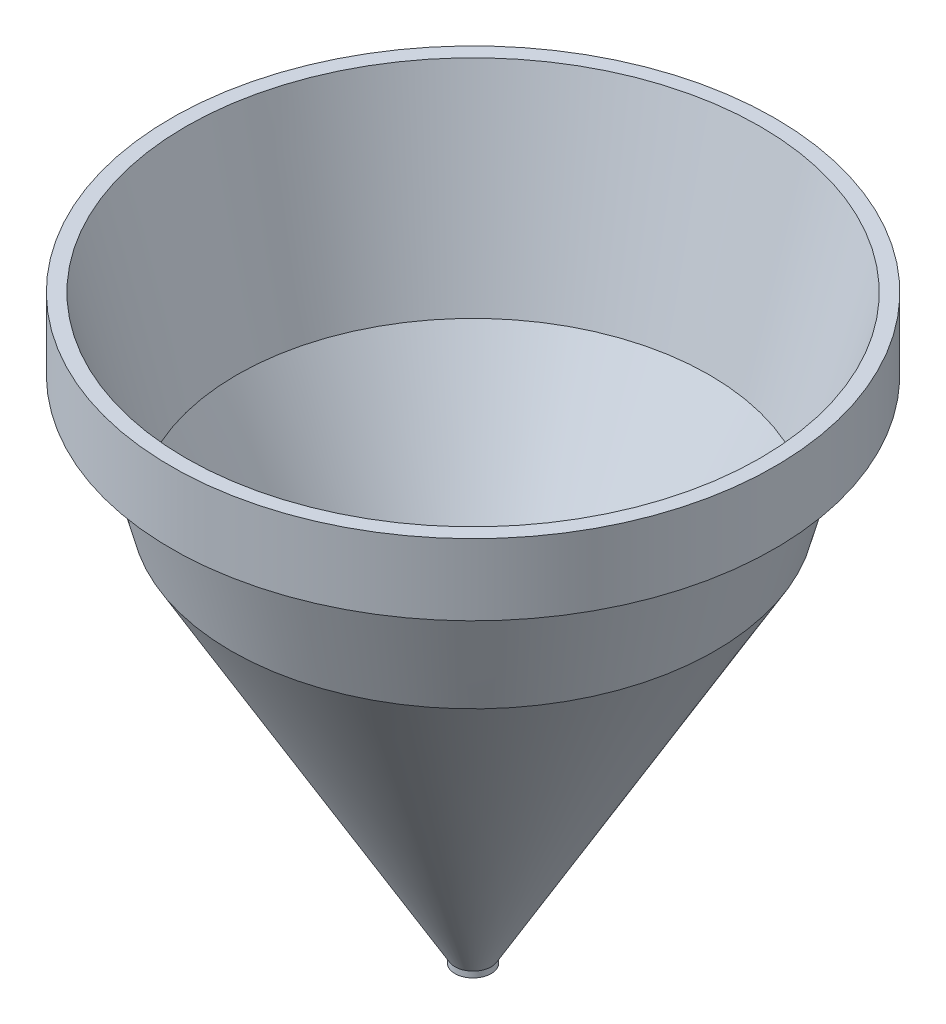
ISO-10303-21;
HEADER;
FILE_DESCRIPTION(('STEP AP214'),'2;1');
FILE_NAME('part.step','',(''),(''),'','','');
FILE_SCHEMA(('AUTOMOTIVE_DESIGN { 1 0 10303 214 1 1 1 1 }'));
ENDSEC;
DATA;
#1=APPLICATION_CONTEXT('core data for automotive mechanical design processes');
#2=APPLICATION_PROTOCOL_DEFINITION('international standard','automotive_design',2000,#1);
#3=PRODUCT_CONTEXT('',#1,'mechanical');
#4=PRODUCT('Part','Part','',(#3));
#5=PRODUCT_RELATED_PRODUCT_CATEGORY('part','',(#4));
#6=PRODUCT_DEFINITION_FORMATION('','',#4);
#7=PRODUCT_DEFINITION_CONTEXT('part definition',#1,'design');
#8=PRODUCT_DEFINITION('design','',#6,#7);
#9=PRODUCT_DEFINITION_SHAPE('','',#8);
#10=(LENGTH_UNIT() NAMED_UNIT(*) SI_UNIT(.MILLI.,.METRE.));
#11=(NAMED_UNIT(*) PLANE_ANGLE_UNIT() SI_UNIT($,.RADIAN.));
#12=(NAMED_UNIT(*) SI_UNIT($,.STERADIAN.) SOLID_ANGLE_UNIT());
#13=UNCERTAINTY_MEASURE_WITH_UNIT(LENGTH_MEASURE(1.E-05),#10,'distance_accuracy_value','');
#14=(GEOMETRIC_REPRESENTATION_CONTEXT(3) GLOBAL_UNCERTAINTY_ASSIGNED_CONTEXT((#13)) GLOBAL_UNIT_ASSIGNED_CONTEXT((#10,
#11,#12)) REPRESENTATION_CONTEXT('',''));
#15=CARTESIAN_POINT('',(0.,0.,0.));
#16=DIRECTION('',(0.,0.,1.));
#17=DIRECTION('',(1.,0.,0.));
#18=AXIS2_PLACEMENT_3D('',#15,#16,#17);
#19=CARTESIAN_POINT('',(0.,130.,0.));
#20=DIRECTION('',(0.,1.,0.));
#21=DIRECTION('',(0.,0.,1.));
#22=AXIS2_PLACEMENT_3D('',#19,#20,#21);
#23=CONICAL_SURFACE('',#22,79.7390432537056,0.261799387799151);
#24=CARTESIAN_POINT('',(0.,194.,0.));
#25=DIRECTION('',(0.,-1.,0.));
#26=DIRECTION('',(0.,0.,-1.));
#27=AXIS2_PLACEMENT_3D('',#24,#25,#26);
#28=CIRCLE('',#27,96.8877915692976);
#29=CARTESIAN_POINT('',(0.,194.,-96.8877915692976));
#30=VERTEX_POINT('',#29);
#31=EDGE_CURVE('E10',#30,#30,#28,.T.);
#32=ORIENTED_EDGE('',*,*,#31,.F.);
#33=EDGE_LOOP('',(#32));
#34=FACE_BOUND('',#33,.T.);
#35=CARTESIAN_POINT('',(0.,130.,0.));
#36=DIRECTION('',(0.,-1.,0.));
#37=DIRECTION('',(0.,0.,-1.));
#38=AXIS2_PLACEMENT_3D('',#35,#36,#37);
#39=CIRCLE('',#38,79.7390432537056);
#40=CARTESIAN_POINT('',(0.,130.,79.7390432537056));
#41=VERTEX_POINT('',#40);
#42=EDGE_CURVE('E72',#41,#41,#39,.T.);
#43=ORIENTED_EDGE('',*,*,#42,.T.);
#44=EDGE_LOOP('',(#43));
#45=FACE_BOUND('',#44,.T.);
#46=ADVANCED_FACE('F32',(#34,#45),#23,.F.);
#47=CARTESIAN_POINT('',(0.,194.,1.09616310980966E-12));
#48=DIRECTION('',(0.,-1.,0.));
#49=DIRECTION('',(0.,0.,-1.));
#50=AXIS2_PLACEMENT_3D('',#47,#48,#49);
#51=PLANE('',#50);
#52=CARTESIAN_POINT('',(0.,194.,0.));
#53=DIRECTION('',(0.,-1.,0.));
#54=DIRECTION('',(0.,0.,-1.));
#55=AXIS2_PLACEMENT_3D('',#52,#53,#54);
#56=CIRCLE('',#55,101.8);
#57=CARTESIAN_POINT('',(0.,194.,-101.8));
#58=VERTEX_POINT('',#57);
#59=EDGE_CURVE('E38',#58,#58,#56,.T.);
#60=ORIENTED_EDGE('',*,*,#59,.F.);
#61=EDGE_LOOP('',(#60));
#62=FACE_BOUND('',#61,.T.);
#63=ORIENTED_EDGE('',*,*,#31,.T.);
#64=EDGE_LOOP('',(#63));
#65=FACE_BOUND('',#64,.T.);
#66=ADVANCED_FACE('F95',(#62,#65),#51,.F.);
#67=CARTESIAN_POINT('',(0.,0.,0.));
#68=DIRECTION('',(0.,-1.,0.));
#69=DIRECTION('',(0.,0.,-1.));
#70=AXIS2_PLACEMENT_3D('',#67,#68,#69);
#71=CYLINDRICAL_SURFACE('',#70,101.8);
#72=ORIENTED_EDGE('',*,*,#59,.T.);
#73=EDGE_LOOP('',(#72));
#74=FACE_BOUND('',#73,.T.);
#75=CARTESIAN_POINT('',(0.,170.,0.));
#76=DIRECTION('',(0.,-1.,0.));
#77=DIRECTION('',(0.,0.,-1.));
#78=AXIS2_PLACEMENT_3D('',#75,#76,#77);
#79=CIRCLE('',#78,101.8);
#80=CARTESIAN_POINT('',(0.,170.,-101.8));
#81=VERTEX_POINT('',#80);
#82=EDGE_CURVE('E42',#81,#81,#79,.T.);
#83=ORIENTED_EDGE('',*,*,#82,.F.);
#84=EDGE_LOOP('',(#83));
#85=FACE_BOUND('',#84,.T.);
#86=ADVANCED_FACE('F100',(#74,#85),#71,.T.);
#87=CARTESIAN_POINT('',(0.,170.,0.));
#88=DIRECTION('',(0.,-1.,0.));
#89=DIRECTION('',(0.,0.,-1.));
#90=AXIS2_PLACEMENT_3D('',#87,#88,#89);
#91=PLANE('',#90);
#92=ORIENTED_EDGE('',*,*,#82,.T.);
#93=EDGE_LOOP('',(#92));
#94=FACE_BOUND('',#93,.T.);
#95=CARTESIAN_POINT('',(0.,170.,0.));
#96=DIRECTION('',(0.,-1.,0.));
#97=DIRECTION('',(0.,0.,-1.));
#98=AXIS2_PLACEMENT_3D('',#95,#96,#97);
#99=CIRCLE('',#98,100.);
#100=CARTESIAN_POINT('',(0.,170.,-100.));
#101=VERTEX_POINT('',#100);
#102=EDGE_CURVE('E46',#101,#101,#99,.T.);
#103=ORIENTED_EDGE('',*,*,#102,.F.);
#104=EDGE_LOOP('',(#103));
#105=FACE_BOUND('',#104,.T.);
#106=ADVANCED_FACE('F105',(#94,#105),#91,.T.);
#107=CARTESIAN_POINT('',(0.,0.,0.));
#108=DIRECTION('',(0.,-1.,0.));
#109=DIRECTION('',(0.,0.,-1.));
#110=AXIS2_PLACEMENT_3D('',#107,#108,#109);
#111=CYLINDRICAL_SURFACE('',#110,100.);
#112=ORIENTED_EDGE('',*,*,#102,.T.);
#113=EDGE_LOOP('',(#112));
#114=FACE_BOUND('',#113,.T.);
#115=CARTESIAN_POINT('',(0.,180.,0.));
#116=DIRECTION('',(0.,-1.,0.));
#117=DIRECTION('',(0.,0.,-1.));
#118=AXIS2_PLACEMENT_3D('',#115,#116,#117);
#119=CIRCLE('',#118,100.);
#120=CARTESIAN_POINT('',(0.,180.,-100.));
#121=VERTEX_POINT('',#120);
#122=EDGE_CURVE('E51',#121,#121,#119,.T.);
#123=ORIENTED_EDGE('',*,*,#122,.F.);
#124=EDGE_LOOP('',(#123));
#125=FACE_BOUND('',#124,.T.);
#126=ADVANCED_FACE('F110',(#114,#125),#111,.F.);
#127=CARTESIAN_POINT('',(0.,180.,0.));
#128=DIRECTION('',(0.,1.,0.));
#129=DIRECTION('',(0.,0.,1.));
#130=AXIS2_PLACEMENT_3D('',#127,#128,#129);
#131=PLANE('',#130);
#132=CARTESIAN_POINT('',(0.,180.,0.));
#133=DIRECTION('',(0.,-1.,0.));
#134=DIRECTION('',(0.,0.,-1.));
#135=AXIS2_PLACEMENT_3D('',#132,#133,#134);
#136=CIRCLE('',#135,95.);
#137=CARTESIAN_POINT('',(0.,180.,-95.));
#138=VERTEX_POINT('',#137);
#139=EDGE_CURVE('E54',#138,#138,#136,.T.);
#140=ORIENTED_EDGE('',*,*,#139,.F.);
#141=EDGE_LOOP('',(#140));
#142=FACE_BOUND('',#141,.T.);
#143=ORIENTED_EDGE('',*,*,#122,.T.);
#144=EDGE_LOOP('',(#143));
#145=FACE_BOUND('',#144,.T.);
#146=ADVANCED_FACE('F114',(#142,#145),#131,.F.);
#147=CARTESIAN_POINT('',(0.,180.,0.));
#148=DIRECTION('',(0.,1.,0.));
#149=DIRECTION('',(0.,0.,1.));
#150=AXIS2_PLACEMENT_3D('',#147,#148,#149);
#151=CONICAL_SURFACE('',#150,95.,0.26179938779915);
#152=CARTESIAN_POINT('',(0.,130.,0.));
#153=DIRECTION('',(0.,-1.,0.));
#154=DIRECTION('',(0.,0.,-1.));
#155=AXIS2_PLACEMENT_3D('',#152,#153,#154);
#156=CIRCLE('',#155,81.6025403784438);
#157=CARTESIAN_POINT('',(0.,130.,81.6025403784438));
#158=VERTEX_POINT('',#157);
#159=EDGE_CURVE('E57',#158,#158,#156,.T.);
#160=ORIENTED_EDGE('',*,*,#159,.F.);
#161=EDGE_LOOP('',(#160));
#162=FACE_BOUND('',#161,.T.);
#163=ORIENTED_EDGE('',*,*,#139,.T.);
#164=EDGE_LOOP('',(#163));
#165=FACE_BOUND('',#164,.T.);
#166=ADVANCED_FACE('F118',(#162,#165),#151,.T.);
#167=CARTESIAN_POINT('',(0.,130.,0.));
#168=DIRECTION('',(0.,1.,0.));
#169=DIRECTION('',(0.,0.,1.));
#170=AXIS2_PLACEMENT_3D('',#167,#168,#169);
#171=CONICAL_SURFACE('',#170,81.6025403784438,0.526096173447133);
#172=CARTESIAN_POINT('',(0.,0.,0.));
#173=DIRECTION('',(0.,-1.,0.));
#174=DIRECTION('',(0.,0.,-1.));
#175=AXIS2_PLACEMENT_3D('',#172,#173,#174);
#176=CIRCLE('',#175,6.11349712473817);
#177=CARTESIAN_POINT('',(0.,0.,6.11349712473815));
#178=VERTEX_POINT('',#177);
#179=EDGE_CURVE('E60',#178,#178,#176,.T.);
#180=CARTESIAN_POINT('',(0.,0.,6.11349712473815));
#181=CARTESIAN_POINT('',(0.,1.35416666666664,6.89984132529758));
#182=CARTESIAN_POINT('',(0.,2.7083333333333,7.68618552585701));
#183=CARTESIAN_POINT('',(0.,5.41666666666663,9.25887392697588));
#184=CARTESIAN_POINT('',(0.,6.7708333333333,10.0452181275353));
#185=CARTESIAN_POINT('',(0.,9.47916666666664,11.6179065286542));
#186=CARTESIAN_POINT('',(0.,10.8333333333333,12.4042507292136));
#187=CARTESIAN_POINT('',(0.,13.5416666666666,13.9769391303325));
#188=CARTESIAN_POINT('',(0.,14.8958333333333,14.7632833308919));
#189=CARTESIAN_POINT('',(0.,17.6041666666666,16.3359717320108));
#190=CARTESIAN_POINT('',(0.,18.9583333333333,17.1223159325702));
#191=CARTESIAN_POINT('',(0.,21.6666666666666,18.6950043336891));
#192=CARTESIAN_POINT('',(0.,23.0208333333333,19.4813485342485));
#193=CARTESIAN_POINT('',(0.,25.7291666666666,21.0540369353674));
#194=CARTESIAN_POINT('',(0.,27.0833333333333,21.8403811359268));
#195=CARTESIAN_POINT('',(0.,29.7916666666666,23.4130695370457));
#196=CARTESIAN_POINT('',(0.,31.1458333333333,24.1994137376051));
#197=CARTESIAN_POINT('',(0.,33.8541666666666,25.772102138724));
#198=CARTESIAN_POINT('',(0.,35.2083333333333,26.5584463392834));
#199=CARTESIAN_POINT('',(0.,37.9166666666666,28.1311347404023));
#200=CARTESIAN_POINT('',(0.,39.2708333333333,28.9174789409617));
#201=CARTESIAN_POINT('',(0.,41.9791666666666,30.4901673420806));
#202=CARTESIAN_POINT('',(0.,43.3333333333333,31.27651154264));
#203=CARTESIAN_POINT('',(0.,46.0416666666666,32.8491999437589));
#204=CARTESIAN_POINT('',(0.,47.3958333333333,33.6355441443183));
#205=CARTESIAN_POINT('',(0.,50.1041666666666,35.2082325454372));
#206=CARTESIAN_POINT('',(0.,51.4583333333333,35.9945767459966));
#207=CARTESIAN_POINT('',(0.,54.1666666666666,37.5672651471155));
#208=CARTESIAN_POINT('',(0.,55.5208333333333,38.3536093476749));
#209=CARTESIAN_POINT('',(0.,58.2291666666666,39.9262977487938));
#210=CARTESIAN_POINT('',(0.,59.5833333333333,40.7126419493532));
#211=CARTESIAN_POINT('',(0.,62.2916666666666,42.2853303504721));
#212=CARTESIAN_POINT('',(0.,63.6458333333333,43.0716745510315));
#213=CARTESIAN_POINT('',(0.,66.3541666666666,44.6443629521504));
#214=CARTESIAN_POINT('',(0.,67.7083333333333,45.4307071527099));
#215=CARTESIAN_POINT('',(0.,70.4166666666666,47.0033955538287));
#216=CARTESIAN_POINT('',(0.,71.7708333333333,47.7897397543882));
#217=CARTESIAN_POINT('',(0.,74.4791666666666,49.362428155507));
#218=CARTESIAN_POINT('',(0.,75.8333333333333,50.1487723560665));
#219=CARTESIAN_POINT('',(0.,78.5416666666666,51.7214607571853));
#220=CARTESIAN_POINT('',(0.,79.8958333333333,52.5078049577448));
#221=CARTESIAN_POINT('',(0.,82.6041666666666,54.0804933588636));
#222=CARTESIAN_POINT('',(0.,83.9583333333333,54.8668375594231));
#223=CARTESIAN_POINT('',(0.,86.6666666666666,56.4395259605419));
#224=CARTESIAN_POINT('',(0.,88.0208333333333,57.2258701611014));
#225=CARTESIAN_POINT('',(0.,90.7291666666667,58.7985585622202));
#226=CARTESIAN_POINT('',(0.,92.0833333333333,59.5849027627797));
#227=CARTESIAN_POINT('',(0.,94.7916666666666,61.1575911638985));
#228=CARTESIAN_POINT('',(0.,96.1458333333333,61.943935364458));
#229=CARTESIAN_POINT('',(0.,98.8541666666666,63.5166237655768));
#230=CARTESIAN_POINT('',(0.,100.208333333333,64.3029679661363));
#231=CARTESIAN_POINT('',(0.,102.916666666667,65.8756563672551));
#232=CARTESIAN_POINT('',(0.,104.270833333333,66.6620005678146));
#233=CARTESIAN_POINT('',(0.,106.979166666667,68.2346889689334));
#234=CARTESIAN_POINT('',(0.,108.333333333333,69.0210331694929));
#235=CARTESIAN_POINT('',(0.,111.041666666667,70.5937215706117));
#236=CARTESIAN_POINT('',(0.,112.395833333333,71.3800657711712));
#237=CARTESIAN_POINT('',(0.,115.104166666667,72.9527541722901));
#238=CARTESIAN_POINT('',(0.,116.458333333333,73.7390983728495));
#239=CARTESIAN_POINT('',(0.,119.166666666667,75.3117867739684));
#240=CARTESIAN_POINT('',(0.,120.520833333333,76.0981309745278));
#241=CARTESIAN_POINT('',(0.,123.229166666667,77.6708193756467));
#242=CARTESIAN_POINT('',(0.,124.583333333333,78.4571635762061));
#243=CARTESIAN_POINT('',(0.,127.291666666667,80.029851977325));
#244=CARTESIAN_POINT('',(0.,128.645833333333,80.8161961778844));
#245=CARTESIAN_POINT('',(0.,130.,81.6025403784438));
#246=B_SPLINE_CURVE_WITH_KNOTS('',3,(#180,#181,#182,#183,#184,#185,#186,#187,#188,#189,#190,
#191,#192,#193,#194,#195,#196,#197,#198,#199,#200,#201,#202,#203,#204,#205,#206,#207,#208,#209,
#210,#211,#212,#213,#214,#215,#216,#217,#218,#219,#220,#221,#222,#223,#224,#225,#226,#227,#228,
#229,#230,#231,#232,#233,#234,#235,#236,#237,#238,#239,#240,#241,#242,#243,#244,#245),
.UNSPECIFIED.,.F.,.F.,(4,2,2,2,2,2,2,2,2,2,2,2,2,2,2,2,2,2,2,2,2,2,2,2,2,2,2,2,2,2,2,2,4),(0.,
4.69775915365838,9.39551830731675,14.0932774609751,18.7910366146335,23.4887957682919,
28.1865549219503,32.8843140756087,37.582073229267,42.2798323829254,46.9775915365838,
51.6753506902422,56.3731098439006,61.0708689975589,65.7686281512173,70.4663873048757,
75.1641464585341,79.8619056121924,84.5596647658508,89.2574239195092,93.9551830731676,
98.652942226826,103.350701380484,108.048460534143,112.746219687801,117.443978841459,
122.141737995118,126.839497148776,131.537256302435,136.235015456093,140.932774609751,
145.63053376341,150.328292917068),.UNSPECIFIED.);
#247=EDGE_CURVE('BSEAM122',#178,#158,#246,.T.);
#248=ORIENTED_EDGE('',*,*,#179,.F.);
#249=ORIENTED_EDGE('',*,*,#159,.T.);
#250=ORIENTED_EDGE('',*,*,#247,.T.);
#251=ORIENTED_EDGE('',*,*,#247,.F.);
#252=EDGE_LOOP('',(#248,#250,#249,#251));
#253=FACE_BOUND('',#252,.T.);
#254=ADVANCED_FACE('F122',(#253),#171,.T.);
#255=CARTESIAN_POINT('',(0.,0.,0.));
#256=DIRECTION('',(0.,-1.,0.));
#257=DIRECTION('',(0.,0.,-1.));
#258=AXIS2_PLACEMENT_3D('',#255,#256,#257);
#259=CYLINDRICAL_SURFACE('',#258,6.11349712473818);
#260=CARTESIAN_POINT('',(0.,-2.,0.));
#261=DIRECTION('',(0.,-1.,0.));
#262=DIRECTION('',(0.,0.,-1.));
#263=AXIS2_PLACEMENT_3D('',#260,#261,#262);
#264=CIRCLE('',#263,6.11349712473819);
#265=CARTESIAN_POINT('',(0.,-2.,-6.11349712473819));
#266=VERTEX_POINT('',#265);
#267=EDGE_CURVE('E63',#266,#266,#264,.T.);
#268=ORIENTED_EDGE('',*,*,#267,.F.);
#269=EDGE_LOOP('',(#268));
#270=FACE_BOUND('',#269,.T.);
#271=ORIENTED_EDGE('',*,*,#179,.T.);
#272=EDGE_LOOP('',(#271));
#273=FACE_BOUND('',#272,.T.);
#274=ADVANCED_FACE('F91',(#270,#273),#259,.T.);
#275=CARTESIAN_POINT('',(0.,-2.,0.));
#276=DIRECTION('',(0.,1.,0.));
#277=DIRECTION('',(0.,0.,1.));
#278=AXIS2_PLACEMENT_3D('',#275,#276,#277);
#279=PLANE('',#278);
#280=CARTESIAN_POINT('',(0.,-2.,0.));
#281=DIRECTION('',(0.,-1.,0.));
#282=DIRECTION('',(0.,0.,-1.));
#283=AXIS2_PLACEMENT_3D('',#280,#281,#282);
#284=CIRCLE('',#283,4.25);
#285=CARTESIAN_POINT('',(0.,-2.,-4.25));
#286=VERTEX_POINT('',#285);
#287=EDGE_CURVE('E66',#286,#286,#284,.T.);
#288=ORIENTED_EDGE('',*,*,#287,.F.);
#289=EDGE_LOOP('',(#288));
#290=FACE_BOUND('',#289,.T.);
#291=ORIENTED_EDGE('',*,*,#267,.T.);
#292=EDGE_LOOP('',(#291));
#293=FACE_BOUND('',#292,.T.);
#294=ADVANCED_FACE('F85',(#290,#293),#279,.F.);
#295=CARTESIAN_POINT('',(0.,0.,0.));
#296=DIRECTION('',(0.,-1.,0.));
#297=DIRECTION('',(0.,0.,-1.));
#298=AXIS2_PLACEMENT_3D('',#295,#296,#297);
#299=CYLINDRICAL_SURFACE('',#298,4.25);
#300=ORIENTED_EDGE('',*,*,#287,.T.);
#301=EDGE_LOOP('',(#300));
#302=FACE_BOUND('',#301,.T.);
#303=CARTESIAN_POINT('',(0.,0.,0.));
#304=DIRECTION('',(0.,-1.,0.));
#305=DIRECTION('',(0.,0.,-1.));
#306=AXIS2_PLACEMENT_3D('',#303,#304,#305);
#307=CIRCLE('',#306,4.25);
#308=CARTESIAN_POINT('',(0.,0.,4.25));
#309=VERTEX_POINT('',#308);
#310=EDGE_CURVE('E69',#309,#309,#307,.T.);
#311=ORIENTED_EDGE('',*,*,#310,.F.);
#312=EDGE_LOOP('',(#311));
#313=FACE_BOUND('',#312,.T.);
#314=ADVANCED_FACE('F80',(#302,#313),#299,.F.);
#315=CARTESIAN_POINT('',(0.,0.,0.));
#316=DIRECTION('',(0.,1.,0.));
#317=DIRECTION('',(0.,0.,1.));
#318=AXIS2_PLACEMENT_3D('',#315,#316,#317);
#319=CONICAL_SURFACE('',#318,4.25,0.526096173447133);
#320=CARTESIAN_POINT('',(0.,130.,79.7390432537056));
#321=CARTESIAN_POINT('',(0.,128.645833333333,78.9526990531462));
#322=CARTESIAN_POINT('',(0.,127.291666666667,78.1663548525868));
#323=CARTESIAN_POINT('',(0.,124.583333333333,76.5936664514679));
#324=CARTESIAN_POINT('',(0.,123.229166666667,75.8073222509085));
#325=CARTESIAN_POINT('',(0.,120.520833333333,74.2346338497896));
#326=CARTESIAN_POINT('',(0.,119.166666666667,73.4482896492302));
#327=CARTESIAN_POINT('',(0.,116.458333333333,71.8756012481113));
#328=CARTESIAN_POINT('',(0.,115.104166666667,71.0892570475519));
#329=CARTESIAN_POINT('',(0.,112.395833333333,69.516568646433));
#330=CARTESIAN_POINT('',(0.,111.041666666667,68.7302244458735));
#331=CARTESIAN_POINT('',(0.,108.333333333333,67.1575360447547));
#332=CARTESIAN_POINT('',(0.,106.979166666667,66.3711918441953));
#333=CARTESIAN_POINT('',(0.,104.270833333333,64.7985034430764));
#334=CARTESIAN_POINT('',(0.,102.916666666667,64.0121592425169));
#335=CARTESIAN_POINT('',(0.,100.208333333333,62.4394708413981));
#336=CARTESIAN_POINT('',(0.,98.8541666666667,61.6531266408386));
#337=CARTESIAN_POINT('',(0.,96.1458333333333,60.0804382397198));
#338=CARTESIAN_POINT('',(0.,94.7916666666667,59.2940940391603));
#339=CARTESIAN_POINT('',(0.,92.0833333333333,57.7214056380415));
#340=CARTESIAN_POINT('',(0.,90.7291666666667,56.9350614374821));
#341=CARTESIAN_POINT('',(0.,88.0208333333333,55.3623730363632));
#342=CARTESIAN_POINT('',(0.,86.6666666666667,54.5760288358037));
#343=CARTESIAN_POINT('',(0.,83.9583333333333,53.0033404346849));
#344=CARTESIAN_POINT('',(0.,82.6041666666667,52.2169962341255));
#345=CARTESIAN_POINT('',(0.,79.8958333333333,50.6443078330066));
#346=CARTESIAN_POINT('',(0.,78.5416666666667,49.8579636324472));
#347=CARTESIAN_POINT('',(0.,75.8333333333333,48.2852752313283));
#348=CARTESIAN_POINT('',(0.,74.4791666666667,47.4989310307688));
#349=CARTESIAN_POINT('',(0.,71.7708333333333,45.92624262965));
#350=CARTESIAN_POINT('',(0.,70.4166666666667,45.1398984290905));
#351=CARTESIAN_POINT('',(0.,67.7083333333333,43.5672100279717));
#352=CARTESIAN_POINT('',(0.,66.3541666666667,42.7808658274122));
#353=CARTESIAN_POINT('',(0.,63.6458333333333,41.2081774262934));
#354=CARTESIAN_POINT('',(0.,62.2916666666667,40.4218332257339));
#355=CARTESIAN_POINT('',(0.,59.5833333333333,38.8491448246151));
#356=CARTESIAN_POINT('',(0.,58.2291666666667,38.0628006240556));
#357=CARTESIAN_POINT('',(0.,55.5208333333333,36.4901122229368));
#358=CARTESIAN_POINT('',(0.,54.1666666666667,35.7037680223773));
#359=CARTESIAN_POINT('',(0.,51.4583333333333,34.1310796212585));
#360=CARTESIAN_POINT('',(0.,50.1041666666667,33.344735420699));
#361=CARTESIAN_POINT('',(0.,47.3958333333333,31.7720470195802));
#362=CARTESIAN_POINT('',(0.,46.0416666666667,30.9857028190207));
#363=CARTESIAN_POINT('',(0.,43.3333333333333,29.4130144179019));
#364=CARTESIAN_POINT('',(0.,41.9791666666667,28.6266702173424));
#365=CARTESIAN_POINT('',(0.,39.2708333333333,27.0539818162236));
#366=CARTESIAN_POINT('',(0.,37.9166666666667,26.2676376156641));
#367=CARTESIAN_POINT('',(0.,35.2083333333333,24.6949492145453));
#368=CARTESIAN_POINT('',(0.,33.8541666666667,23.9086050139858));
#369=CARTESIAN_POINT('',(0.,31.1458333333333,22.335916612867));
#370=CARTESIAN_POINT('',(0.,29.7916666666667,21.5495724123075));
#371=CARTESIAN_POINT('',(0.,27.0833333333333,19.9768840111887));
#372=CARTESIAN_POINT('',(0.,25.7291666666667,19.1905398106292));
#373=CARTESIAN_POINT('',(0.,23.0208333333333,17.6178514095104));
#374=CARTESIAN_POINT('',(0.,21.6666666666667,16.8315072089509));
#375=CARTESIAN_POINT('',(0.,18.9583333333333,15.2588188078321));
#376=CARTESIAN_POINT('',(0.,17.6041666666667,14.4724746072726));
#377=CARTESIAN_POINT('',(0.,14.8958333333333,12.8997862061538));
#378=CARTESIAN_POINT('',(0.,13.5416666666667,12.1134420055943));
#379=CARTESIAN_POINT('',(0.,10.8333333333333,10.5407536044755));
#380=CARTESIAN_POINT('',(0.,9.47916666666666,9.75440940391603));
#381=CARTESIAN_POINT('',(0.,6.77083333333333,8.18172100279716));
#382=CARTESIAN_POINT('',(0.,5.41666666666666,7.39537680223773));
#383=CARTESIAN_POINT('',(0.,2.70833333333333,5.82268840111887));
#384=CARTESIAN_POINT('',(0.,1.35416666666666,5.03634420055943));
#385=CARTESIAN_POINT('',(0.,0.,4.25));
#386=B_SPLINE_CURVE_WITH_KNOTS('',3,(#320,#321,#322,#323,#324,#325,#326,#327,#328,#329,#330,
#331,#332,#333,#334,#335,#336,#337,#338,#339,#340,#341,#342,#343,#344,#345,#346,#347,#348,#349,
#350,#351,#352,#353,#354,#355,#356,#357,#358,#359,#360,#361,#362,#363,#364,#365,#366,#367,#368,
#369,#370,#371,#372,#373,#374,#375,#376,#377,#378,#379,#380,#381,#382,#383,#384,#385),
.UNSPECIFIED.,.F.,.F.,(4,2,2,2,2,2,2,2,2,2,2,2,2,2,2,2,2,2,2,2,2,2,2,2,2,2,2,2,2,2,2,2,4),(0.,
4.69775915365838,9.39551830731675,14.0932774609751,18.7910366146335,23.4887957682919,
28.1865549219503,32.8843140756087,37.582073229267,42.2798323829254,46.9775915365838,
51.6753506902422,56.3731098439006,61.0708689975589,65.7686281512173,70.4663873048757,
75.1641464585341,79.8619056121924,84.5596647658508,89.2574239195092,93.9551830731676,
98.652942226826,103.350701380484,108.048460534143,112.746219687801,117.443978841459,
122.141737995118,126.839497148776,131.537256302435,136.235015456093,140.932774609751,
145.63053376341,150.328292917068),.UNSPECIFIED.);
#387=EDGE_CURVE('BSEAM77',#41,#309,#386,.T.);
#388=ORIENTED_EDGE('',*,*,#42,.F.);
#389=ORIENTED_EDGE('',*,*,#310,.T.);
#390=ORIENTED_EDGE('',*,*,#387,.T.);
#391=ORIENTED_EDGE('',*,*,#387,.F.);
#392=EDGE_LOOP('',(#388,#390,#389,#391));
#393=FACE_BOUND('',#392,.T.);
#394=ADVANCED_FACE('F77',(#393),#319,.F.);
#395=CLOSED_SHELL('',(#46,#66,#86,#106,#126,#146,#166,#254,#274,#294,#314,#394));
#396=MANIFOLD_SOLID_BREP('B2',#395);
#397=ADVANCED_BREP_SHAPE_REPRESENTATION('',(#18,#396),#14);
#398=SHAPE_DEFINITION_REPRESENTATION(#9,#397);
ENDSEC;
END-ISO-10303-21;
